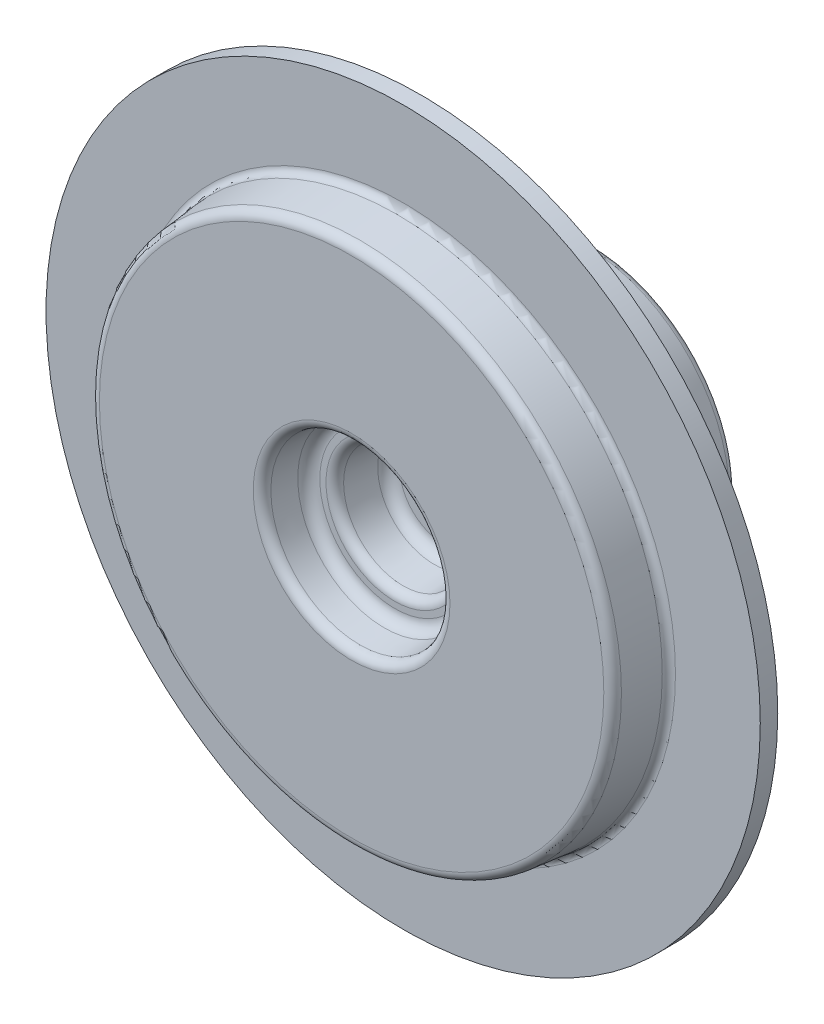
ISO-10303-21;
HEADER;
FILE_DESCRIPTION(('STEP AP214'),'2;1');
FILE_NAME('part.step','',(''),(''),'','','');
FILE_SCHEMA(('AUTOMOTIVE_DESIGN { 1 0 10303 214 1 1 1 1 }'));
ENDSEC;
DATA;
#1=APPLICATION_CONTEXT('core data for automotive mechanical design processes');
#2=APPLICATION_PROTOCOL_DEFINITION('international standard','automotive_design',2000,#1);
#3=PRODUCT_CONTEXT('',#1,'mechanical');
#4=PRODUCT('Part','Part','',(#3));
#5=PRODUCT_RELATED_PRODUCT_CATEGORY('part','',(#4));
#6=PRODUCT_DEFINITION_FORMATION('','',#4);
#7=PRODUCT_DEFINITION_CONTEXT('part definition',#1,'design');
#8=PRODUCT_DEFINITION('design','',#6,#7);
#9=PRODUCT_DEFINITION_SHAPE('','',#8);
#10=(LENGTH_UNIT() NAMED_UNIT(*) SI_UNIT(.MILLI.,.METRE.));
#11=(NAMED_UNIT(*) PLANE_ANGLE_UNIT() SI_UNIT($,.RADIAN.));
#12=(NAMED_UNIT(*) SI_UNIT($,.STERADIAN.) SOLID_ANGLE_UNIT());
#13=UNCERTAINTY_MEASURE_WITH_UNIT(LENGTH_MEASURE(1.E-05),#10,'distance_accuracy_value','');
#14=(GEOMETRIC_REPRESENTATION_CONTEXT(3) GLOBAL_UNCERTAINTY_ASSIGNED_CONTEXT((#13)) GLOBAL_UNIT_ASSIGNED_CONTEXT((#10,
#11,#12)) REPRESENTATION_CONTEXT('',''));
#15=CARTESIAN_POINT('',(0.,0.,0.));
#16=DIRECTION('',(0.,0.,1.));
#17=DIRECTION('',(1.,0.,0.));
#18=AXIS2_PLACEMENT_3D('',#15,#16,#17);
#19=CARTESIAN_POINT('',(-1.69097512300319E-13,0.,-49.2959876543209));
#20=DIRECTION('',(0.,0.,-1.));
#21=DIRECTION('',(-1.,0.,0.));
#22=AXIS2_PLACEMENT_3D('',#19,#20,#21);
#23=CONICAL_SURFACE('',#22,26.1000000000002,0.104719755119659);
#24=CARTESIAN_POINT('',(-1.04593999800566E-13,0.,-30.4916639679921));
#25=DIRECTION('',(0.,0.,-1.));
#26=DIRECTION('',(-1.,0.,0.));
#27=AXIS2_PLACEMENT_3D('',#24,#25,#26);
#28=CIRCLE('',#27,24.1235859392604);
#29=CARTESIAN_POINT('',(-24.1235859392605,0.,-30.491663967992));
#30=VERTEX_POINT('',#29);
#31=EDGE_CURVE('E69',#30,#30,#28,.F.);
#32=ORIENTED_EDGE('',*,*,#31,.T.);
#33=EDGE_LOOP('',(#32));
#34=FACE_BOUND('',#33,.T.);
#35=CARTESIAN_POINT('',(-1.56810750930692E-13,0.,-45.7141015073914));
#36=DIRECTION('',(0.,0.,1.));
#37=DIRECTION('',(1.,0.,0.));
#38=AXIS2_PLACEMENT_3D('',#35,#36,#37);
#39=CIRCLE('',#38,25.7235285957184);
#40=CARTESIAN_POINT('',(25.7235285957183,0.,-45.7141015073915));
#41=VERTEX_POINT('',#40);
#42=EDGE_CURVE('E153',#41,#41,#39,.F.);
#43=ORIENTED_EDGE('',*,*,#42,.T.);
#44=EDGE_LOOP('',(#43));
#45=FACE_BOUND('',#44,.T.);
#46=ADVANCED_FACE('F41',(#34,#45),#23,.F.);
#47=CARTESIAN_POINT('',(26.1,0.,-49.2959876543208));
#48=DIRECTION('',(0.,0.,-1.));
#49=DIRECTION('',(-1.,0.,0.));
#50=AXIS2_PLACEMENT_3D('',#47,#48,#49);
#51=PLANE('',#50);
#52=CARTESIAN_POINT('',(-1.69097512300318E-13,0.,-49.2959876543207));
#53=DIRECTION('',(0.,0.,-1.));
#54=DIRECTION('',(-1.,0.,0.));
#55=AXIS2_PLACEMENT_3D('',#52,#53,#54);
#56=CIRCLE('',#55,32.1535514260961);
#57=CARTESIAN_POINT('',(-32.1535514260963,0.,-49.2959876543206));
#58=VERTEX_POINT('',#57);
#59=EDGE_CURVE('E73',#58,#58,#56,.T.);
#60=ORIENTED_EDGE('',*,*,#59,.T.);
#61=EDGE_LOOP('',(#60));
#62=FACE_BOUND('',#61,.T.);
#63=CARTESIAN_POINT('',(-1.69097512300319E-13,0.,-49.2959876543207));
#64=DIRECTION('',(0.,0.,-1.));
#65=DIRECTION('',(-1.,0.,0.));
#66=AXIS2_PLACEMENT_3D('',#63,#64,#65);
#67=CIRCLE('',#66,29.7016161771915);
#68=CARTESIAN_POINT('',(-29.7016161771917,0.,-49.2959876543206));
#69=VERTEX_POINT('',#68);
#70=EDGE_CURVE('E157',#69,#69,#67,.F.);
#71=ORIENTED_EDGE('',*,*,#70,.T.);
#72=EDGE_LOOP('',(#71));
#73=FACE_BOUND('',#72,.T.);
#74=ADVANCED_FACE('F212',(#62,#73),#51,.T.);
#75=CARTESIAN_POINT('',(-2.32557118779704E-13,0.,-67.7959876543206));
#76=DIRECTION('',(0.,0.,-1.));
#77=DIRECTION('',(-1.,0.,0.));
#78=AXIS2_PLACEMENT_3D('',#75,#76,#77);
#79=CONICAL_SURFACE('',#78,38.6000000000003,0.104719755119664);
#80=CARTESIAN_POINT('',(-1.84455964012352E-13,0.,-53.7733453379825));
#81=DIRECTION('',(0.,0.,-1.));
#82=DIRECTION('',(-1.,0.,0.));
#83=AXIS2_PLACEMENT_3D('',#80,#81,#82);
#84=CIRCLE('',#83,37.1261609029374);
#85=CARTESIAN_POINT('',(-37.1261609029376,0.,-53.7733453379823));
#86=VERTEX_POINT('',#85);
#87=EDGE_CURVE('E77',#86,#86,#84,.F.);
#88=ORIENTED_EDGE('',*,*,#87,.T.);
#89=EDGE_LOOP('',(#88));
#90=FACE_BOUND('',#89,.T.);
#91=CARTESIAN_POINT('',(-2.20270357410077E-13,0.,-64.2141015073913));
#92=DIRECTION('',(0.,0.,1.));
#93=DIRECTION('',(1.,0.,0.));
#94=AXIS2_PLACEMENT_3D('',#91,#92,#93);
#95=CIRCLE('',#94,38.2235285957186);
#96=CARTESIAN_POINT('',(38.2235285957184,0.,-64.2141015073914));
#97=VERTEX_POINT('',#96);
#98=EDGE_CURVE('E121',#97,#97,#95,.F.);
#99=ORIENTED_EDGE('',*,*,#98,.T.);
#100=EDGE_LOOP('',(#99));
#101=FACE_BOUND('',#100,.T.);
#102=ADVANCED_FACE('F218',(#90,#101),#79,.F.);
#103=CARTESIAN_POINT('',(38.6000000000001,0.,-67.7959876543208));
#104=DIRECTION('',(0.,0.,-1.));
#105=DIRECTION('',(-1.,0.,0.));
#106=AXIS2_PLACEMENT_3D('',#103,#104,#105);
#107=PLANE('',#106);
#108=CARTESIAN_POINT('',(-2.32557118779705E-13,0.,-67.7959876543207));
#109=DIRECTION('',(0.,0.,-1.));
#110=DIRECTION('',(-1.,0.,0.));
#111=AXIS2_PLACEMENT_3D('',#108,#109,#110);
#112=CIRCLE('',#111,42.2016161771917);
#113=CARTESIAN_POINT('',(-42.2016161771919,0.,-67.7959876543205));
#114=VERTEX_POINT('',#113);
#115=EDGE_CURVE('E125',#114,#114,#112,.F.);
#116=ORIENTED_EDGE('',*,*,#115,.T.);
#117=EDGE_LOOP('',(#116));
#118=FACE_BOUND('',#117,.T.);
#119=CARTESIAN_POINT('',(-2.32557118779705E-13,0.,-67.7959876543207));
#120=DIRECTION('',(0.,0.,-1.));
#121=DIRECTION('',(-1.,0.,0.));
#122=AXIS2_PLACEMENT_3D('',#119,#120,#121);
#123=CIRCLE('',#122,58.2436014752911);
#124=CARTESIAN_POINT('',(-58.2436014752913,0.,-67.7959876543205));
#125=VERTEX_POINT('',#124);
#126=EDGE_CURVE('E169',#125,#125,#123,.T.);
#127=ORIENTED_EDGE('',*,*,#126,.T.);
#128=EDGE_LOOP('',(#127));
#129=FACE_BOUND('',#128,.T.);
#130=ADVANCED_FACE('F585',(#118,#129),#107,.T.);
#131=CARTESIAN_POINT('',(-1.47143918707449E-13,0.,-42.8959876543207));
#132=DIRECTION('',(0.,0.,1.));
#133=DIRECTION('',(1.,0.,0.));
#134=AXIS2_PLACEMENT_3D('',#131,#132,#133);
#135=CONICAL_SURFACE('',#134,65.990541819641,0.174532925199432);
#136=CARTESIAN_POINT('',(-1.61316881263876E-13,0.,-47.027746765986));
#137=DIRECTION('',(0.,0.,1.));
#138=DIRECTION('',(1.,0.,0.));
#139=AXIS2_PLACEMENT_3D('',#136,#137,#138);
#140=CIRCLE('',#139,65.2620012104663);
#141=CARTESIAN_POINT('',(65.2620012104662,0.,-47.0277467659862));
#142=VERTEX_POINT('',#141);
#143=EDGE_CURVE('E81',#142,#142,#140,.F.);
#144=ORIENTED_EDGE('',*,*,#143,.T.);
#145=EDGE_LOOP('',(#144));
#146=FACE_BOUND('',#145,.T.);
#147=CARTESIAN_POINT('',(-2.21218748734563E-13,0.,-64.4905803649884));
#148=DIRECTION('',(0.,0.,-1.));
#149=DIRECTION('',(-1.,0.,0.));
#150=AXIS2_PLACEMENT_3D('',#147,#148,#149);
#151=CIRCLE('',#150,62.1828324873399);
#152=CARTESIAN_POINT('',(-62.1828324873402,0.,-64.4905803649882));
#153=VERTEX_POINT('',#152);
#154=EDGE_CURVE('E173',#153,#153,#151,.F.);
#155=ORIENTED_EDGE('',*,*,#154,.T.);
#156=EDGE_LOOP('',(#155));
#157=FACE_BOUND('',#156,.T.);
#158=ADVANCED_FACE('F575',(#146,#157),#135,.T.);
#159=CARTESIAN_POINT('',(65.9905418196408,0.,-42.8959876543209));
#160=DIRECTION('',(0.,0.,-1.));
#161=DIRECTION('',(-1.,0.,0.));
#162=AXIS2_PLACEMENT_3D('',#159,#160,#161);
#163=PLANE('',#162);
#164=CARTESIAN_POINT('',(-1.47143918707449E-13,0.,-42.8959876543206));
#165=DIRECTION('',(0.,0.,-1.));
#166=DIRECTION('',(-1.,0.,0.));
#167=AXIS2_PLACEMENT_3D('',#164,#165,#166);
#168=CIRCLE('',#167,70.1860399755274);
#169=CARTESIAN_POINT('',(-70.1860399755275,0.,-42.8959876543204));
#170=VERTEX_POINT('',#169);
#171=EDGE_CURVE('E85',#170,#170,#168,.F.);
#172=ORIENTED_EDGE('',*,*,#171,.T.);
#173=EDGE_LOOP('',(#172));
#174=FACE_BOUND('',#173,.T.);
#175=CARTESIAN_POINT('',(-1.47143918707449E-13,0.,-42.8959876543206));
#176=DIRECTION('',(0.,0.,-1.));
#177=DIRECTION('',(-1.,0.,0.));
#178=AXIS2_PLACEMENT_3D('',#175,#176,#177);
#179=CIRCLE('',#178,72.9983838228087);
#180=CARTESIAN_POINT('',(-72.9983838228089,0.,-42.8959876543204));
#181=VERTEX_POINT('',#180);
#182=EDGE_CURVE('E129',#181,#181,#179,.T.);
#183=ORIENTED_EDGE('',*,*,#182,.T.);
#184=EDGE_LOOP('',(#183));
#185=FACE_BOUND('',#184,.T.);
#186=ADVANCED_FACE('F565',(#174,#185),#163,.T.);
#187=CARTESIAN_POINT('',(0.,0.,-17.3959876543206));
#188=DIRECTION('',(0.,0.,1.));
#189=DIRECTION('',(1.,0.,0.));
#190=AXIS2_PLACEMENT_3D('',#187,#188,#189);
#191=CONICAL_SURFACE('',#190,79.2801579992745,0.104719755119645);
#192=CARTESIAN_POINT('',(0.,0.,-21.8733453379823));
#193=DIRECTION('',(0.,0.,1.));
#194=DIRECTION('',(1.,0.,0.));
#195=AXIS2_PLACEMENT_3D('',#192,#193,#194);
#196=CIRCLE('',#195,78.8095687439224);
#197=CARTESIAN_POINT('',(78.8095687439224,0.,-21.8733453379826));
#198=VERTEX_POINT('',#197);
#199=EDGE_CURVE('E89',#198,#198,#196,.F.);
#200=ORIENTED_EDGE('',*,*,#199,.T.);
#201=EDGE_LOOP('',(#200));
#202=FACE_BOUND('',#201,.T.);
#203=CARTESIAN_POINT('',(-1.34857157337822E-13,0.,-39.3141015073912));
#204=DIRECTION('',(0.,0.,-1.));
#205=DIRECTION('',(-1.,0.,0.));
#206=AXIS2_PLACEMENT_3D('',#203,#204,#205);
#207=CIRCLE('',#206,76.9764714042818);
#208=CARTESIAN_POINT('',(-76.976471404282,0.,-39.314101507391));
#209=VERTEX_POINT('',#208);
#210=EDGE_CURVE('E133',#209,#209,#207,.F.);
#211=ORIENTED_EDGE('',*,*,#210,.T.);
#212=EDGE_LOOP('',(#211));
#213=FACE_BOUND('',#212,.T.);
#214=ADVANCED_FACE('F555',(#202,#213),#191,.T.);
#215=CARTESIAN_POINT('',(79.2801579992745,0.,-17.3959876543208));
#216=DIRECTION('',(0.,0.,-1.));
#217=DIRECTION('',(-1.,0.,0.));
#218=AXIS2_PLACEMENT_3D('',#215,#216,#217);
#219=PLANE('',#218);
#220=CARTESIAN_POINT('',(0.,0.,-17.3959876543205));
#221=DIRECTION('',(0.,0.,-1.));
#222=DIRECTION('',(-1.,0.,0.));
#223=AXIS2_PLACEMENT_3D('',#220,#221,#222);
#224=CIRCLE('',#223,83.7821782207638);
#225=CARTESIAN_POINT('',(-83.7821782207638,0.,-17.3959876543202));
#226=VERTEX_POINT('',#225);
#227=EDGE_CURVE('E93',#226,#226,#224,.F.);
#228=ORIENTED_EDGE('',*,*,#227,.T.);
#229=EDGE_LOOP('',(#228));
#230=FACE_BOUND('',#229,.T.);
#231=CARTESIAN_POINT('',(0.,0.,-17.3959876543205));
#232=DIRECTION('',(0.,0.,-1.));
#233=DIRECTION('',(-1.,0.,0.));
#234=AXIS2_PLACEMENT_3D('',#231,#232,#233);
#235=CIRCLE('',#234,107.617071540778);
#236=CARTESIAN_POINT('',(-107.617071540778,0.,-17.3959876543202));
#237=VERTEX_POINT('',#236);
#238=EDGE_CURVE('E137',#237,#237,#235,.T.);
#239=ORIENTED_EDGE('',*,*,#238,.T.);
#240=EDGE_LOOP('',(#239));
#241=FACE_BOUND('',#240,.T.);
#242=ADVANCED_FACE('F400',(#230,#241),#219,.T.);
#243=CARTESIAN_POINT('',(0.,0.,10.2504208021552));
#244=DIRECTION('',(0.,0.,1.));
#245=DIRECTION('',(1.,0.,0.));
#246=AXIS2_PLACEMENT_3D('',#243,#244,#245);
#247=CONICAL_SURFACE('',#246,114.12444233663,0.104719755119649);
#248=CARTESIAN_POINT('',(0.,0.,7.56400619195805));
#249=DIRECTION('',(0.,0.,1.));
#250=DIRECTION('',(1.,0.,0.));
#251=AXIS2_PLACEMENT_3D('',#248,#249,#250);
#252=CIRCLE('',#251,113.842088783419);
#253=CARTESIAN_POINT('',(113.842088783419,0.,7.56400619195766));
#254=VERTEX_POINT('',#253);
#255=EDGE_CURVE('E10',#254,#254,#252,.F.);
#256=ORIENTED_EDGE('',*,*,#255,.T.);
#257=EDGE_LOOP('',(#256));
#258=FACE_BOUND('',#257,.T.);
#259=CARTESIAN_POINT('',(0.,0.,-13.8141015073914));
#260=DIRECTION('',(0.,0.,-1.));
#261=DIRECTION('',(-1.,0.,0.));
#262=AXIS2_PLACEMENT_3D('',#259,#260,#261);
#263=CIRCLE('',#262,111.595159122252);
#264=CARTESIAN_POINT('',(-111.595159122252,0.,-13.814101507391));
#265=VERTEX_POINT('',#264);
#266=EDGE_CURVE('E141',#265,#265,#263,.F.);
#267=ORIENTED_EDGE('',*,*,#266,.T.);
#268=EDGE_LOOP('',(#267));
#269=FACE_BOUND('',#268,.T.);
#270=ADVANCED_FACE('F394',(#258,#269),#247,.T.);
#271=CARTESIAN_POINT('',(114.12444233663,0.,10.2504208021547));
#272=DIRECTION('',(0.,0.,-1.));
#273=DIRECTION('',(-1.,0.,0.));
#274=AXIS2_PLACEMENT_3D('',#271,#272,#273);
#275=PLANE('',#274);
#276=CARTESIAN_POINT('',(0.,0.,10.2504208021551));
#277=DIRECTION('',(0.,0.,-1.));
#278=DIRECTION('',(-1.,0.,0.));
#279=AXIS2_PLACEMENT_3D('',#276,#277,#278);
#280=CIRCLE('',#279,116.825654469523);
#281=CARTESIAN_POINT('',(-116.825654469523,0.,10.2504208021555));
#282=VERTEX_POINT('',#281);
#283=EDGE_CURVE('E49',#282,#282,#280,.F.);
#284=ORIENTED_EDGE('',*,*,#283,.T.);
#285=EDGE_LOOP('',(#284));
#286=FACE_BOUND('',#285,.T.);
#287=CARTESIAN_POINT('',(0.,0.,10.2504208021552));
#288=DIRECTION('',(0.,0.,1.));
#289=DIRECTION('',(1.,0.,0.));
#290=AXIS2_PLACEMENT_3D('',#287,#288,#289);
#291=CIRCLE('',#290,127.79444233663);
#292=CARTESIAN_POINT('',(127.79444233663,0.,10.2504208021548));
#293=VERTEX_POINT('',#292);
#294=EDGE_CURVE('E177',#293,#293,#291,.T.);
#295=ORIENTED_EDGE('',*,*,#294,.F.);
#296=EDGE_LOOP('',(#295));
#297=FACE_BOUND('',#296,.T.);
#298=ADVANCED_FACE('F399',(#286,#297),#275,.T.);
#299=CARTESIAN_POINT('',(0.,0.,5.79449500213691));
#300=DIRECTION('',(0.,0.,-1.));
#301=DIRECTION('',(-1.,0.,0.));
#302=AXIS2_PLACEMENT_3D('',#299,#300,#301);
#303=CONICAL_SURFACE('',#302,144.310706439968,1.30728006977126);
#304=ORIENTED_EDGE('',*,*,#294,.T.);
#305=EDGE_LOOP('',(#304));
#306=FACE_BOUND('',#305,.T.);
#307=CARTESIAN_POINT('',(0.,0.,5.79449500213691));
#308=DIRECTION('',(0.,0.,1.));
#309=DIRECTION('',(1.,0.,0.));
#310=AXIS2_PLACEMENT_3D('',#307,#308,#309);
#311=CIRCLE('',#310,144.310706439968);
#312=CARTESIAN_POINT('',(144.310706439968,0.,5.79449500213642));
#313=VERTEX_POINT('',#312);
#314=EDGE_CURVE('E181',#313,#313,#311,.T.);
#315=ORIENTED_EDGE('',*,*,#314,.F.);
#316=EDGE_LOOP('',(#315));
#317=FACE_BOUND('',#316,.T.);
#318=ADVANCED_FACE('F208',(#306,#317),#303,.F.);
#319=CARTESIAN_POINT('',(144.310706439968,0.,5.79449500213638));
#320=DIRECTION('',(0.,0.,-1.));
#321=DIRECTION('',(-1.,0.,0.));
#322=AXIS2_PLACEMENT_3D('',#319,#320,#321);
#323=PLANE('',#322);
#324=ORIENTED_EDGE('',*,*,#314,.T.);
#325=EDGE_LOOP('',(#324));
#326=FACE_BOUND('',#325,.T.);
#327=CARTESIAN_POINT('',(0.,0.,5.79449500213691));
#328=DIRECTION('',(0.,0.,1.));
#329=DIRECTION('',(1.,0.,0.));
#330=AXIS2_PLACEMENT_3D('',#327,#328,#329);
#331=CIRCLE('',#330,153.205859623628);
#332=CARTESIAN_POINT('',(153.205859623628,0.,5.79449500213639));
#333=VERTEX_POINT('',#332);
#334=EDGE_CURVE('E185',#333,#333,#331,.T.);
#335=ORIENTED_EDGE('',*,*,#334,.F.);
#336=EDGE_LOOP('',(#335));
#337=FACE_BOUND('',#336,.T.);
#338=ADVANCED_FACE('F198',(#326,#337),#323,.T.);
#339=CARTESIAN_POINT('',(4.29898307583795E-12,0.,1253.2568560575));
#340=DIRECTION('',(0.,0.,1.));
#341=DIRECTION('',(1.,0.,0.));
#342=AXIS2_PLACEMENT_3D('',#339,#340,#341);
#343=CYLINDRICAL_SURFACE('',#342,153.205859623628);
#344=ORIENTED_EDGE('',*,*,#334,.T.);
#345=EDGE_LOOP('',(#344));
#346=FACE_BOUND('',#345,.T.);
#347=CARTESIAN_POINT('',(0.,0.,13.2884208021551));
#348=DIRECTION('',(0.,0.,1.));
#349=DIRECTION('',(1.,0.,0.));
#350=AXIS2_PLACEMENT_3D('',#347,#348,#349);
#351=CIRCLE('',#350,153.205859623628);
#352=CARTESIAN_POINT('',(153.205859623628,0.,13.2884208021546));
#353=VERTEX_POINT('',#352);
#354=EDGE_CURVE('E189',#353,#353,#351,.T.);
#355=ORIENTED_EDGE('',*,*,#354,.F.);
#356=EDGE_LOOP('',(#355));
#357=FACE_BOUND('',#356,.T.);
#358=ADVANCED_FACE('F196',(#346,#357),#343,.T.);
#359=CARTESIAN_POINT('',(153.205859623628,0.,13.2884208021546));
#360=DIRECTION('',(0.,0.,1.));
#361=DIRECTION('',(1.,0.,0.));
#362=AXIS2_PLACEMENT_3D('',#359,#360,#361);
#363=PLANE('',#362);
#364=CARTESIAN_POINT('',(0.,0.,13.2884208021552));
#365=DIRECTION('',(0.,0.,1.));
#366=DIRECTION('',(1.,0.,0.));
#367=AXIS2_PLACEMENT_3D('',#364,#365,#366);
#368=CIRCLE('',#367,116.825654469524);
#369=CARTESIAN_POINT('',(116.825654469524,0.,13.2884208021548));
#370=VERTEX_POINT('',#369);
#371=EDGE_CURVE('E54',#370,#370,#368,.F.);
#372=ORIENTED_EDGE('',*,*,#371,.T.);
#373=EDGE_LOOP('',(#372));
#374=FACE_BOUND('',#373,.T.);
#375=ORIENTED_EDGE('',*,*,#354,.T.);
#376=EDGE_LOOP('',(#375));
#377=FACE_BOUND('',#376,.T.);
#378=ADVANCED_FACE('F194',(#374,#377),#363,.T.);
#379=CARTESIAN_POINT('',(1.21444577905307E-13,0.,35.4040123456796));
#380=DIRECTION('',(0.,0.,-1.));
#381=DIRECTION('',(-1.,0.,0.));
#382=AXIS2_PLACEMENT_3D('',#379,#380,#381);
#383=CONICAL_SURFACE('',#382,111.8,0.104719755119656);
#384=CARTESIAN_POINT('',(0.,0.,15.9748354123522));
#385=DIRECTION('',(0.,0.,-1.));
#386=DIRECTION('',(-1.,0.,0.));
#387=AXIS2_PLACEMENT_3D('',#384,#385,#386);
#388=CIRCLE('',#387,113.842088783419);
#389=CARTESIAN_POINT('',(-113.842088783419,0.,15.9748354123526));
#390=VERTEX_POINT('',#389);
#391=EDGE_CURVE('E59',#390,#390,#388,.F.);
#392=ORIENTED_EDGE('',*,*,#391,.T.);
#393=EDGE_LOOP('',(#392));
#394=FACE_BOUND('',#393,.T.);
#395=CARTESIAN_POINT('',(1.09157816535679E-13,0.,31.8221261987501));
#396=DIRECTION('',(0.,0.,1.));
#397=DIRECTION('',(1.,0.,0.));
#398=AXIS2_PLACEMENT_3D('',#395,#396,#397);
#399=CIRCLE('',#398,112.176471404282);
#400=CARTESIAN_POINT('',(112.176471404282,0.,31.8221261987498));
#401=VERTEX_POINT('',#400);
#402=EDGE_CURVE('E145',#401,#401,#399,.F.);
#403=ORIENTED_EDGE('',*,*,#402,.T.);
#404=EDGE_LOOP('',(#403));
#405=FACE_BOUND('',#404,.T.);
#406=ADVANCED_FACE('F205',(#394,#405),#383,.T.);
#407=CARTESIAN_POINT('',(111.8,0.,35.404012345679));
#408=DIRECTION('',(0.,0.,1.));
#409=DIRECTION('',(1.,0.,0.));
#410=AXIS2_PLACEMENT_3D('',#407,#408,#409);
#411=PLANE('',#410);
#412=CARTESIAN_POINT('',(1.21444577905307E-13,0.,35.4040123456794));
#413=DIRECTION('',(0.,0.,1.));
#414=DIRECTION('',(1.,0.,0.));
#415=AXIS2_PLACEMENT_3D('',#412,#413,#414);
#416=CIRCLE('',#415,42.2016161771913);
#417=CARTESIAN_POINT('',(42.2016161771914,0.,35.4040123456792));
#418=VERTEX_POINT('',#417);
#419=EDGE_CURVE('E113',#418,#418,#416,.F.);
#420=ORIENTED_EDGE('',*,*,#419,.T.);
#421=EDGE_LOOP('',(#420));
#422=FACE_BOUND('',#421,.T.);
#423=CARTESIAN_POINT('',(1.21444577905306E-13,0.,35.4040123456794));
#424=DIRECTION('',(0.,0.,1.));
#425=DIRECTION('',(1.,0.,0.));
#426=AXIS2_PLACEMENT_3D('',#423,#424,#425);
#427=CIRCLE('',#426,108.198383822808);
#428=CARTESIAN_POINT('',(108.198383822809,0.,35.404012345679));
#429=VERTEX_POINT('',#428);
#430=EDGE_CURVE('E149',#429,#429,#427,.T.);
#431=ORIENTED_EDGE('',*,*,#430,.T.);
#432=EDGE_LOOP('',(#431));
#433=FACE_BOUND('',#432,.T.);
#434=ADVANCED_FACE('F293',(#422,#433),#411,.T.);
#435=CARTESIAN_POINT('',(0.,0.,16.9040123456794));
#436=DIRECTION('',(0.,0.,1.));
#437=DIRECTION('',(1.,0.,0.));
#438=AXIS2_PLACEMENT_3D('',#435,#436,#437);
#439=CONICAL_SURFACE('',#438,36.6555716475851,0.104719755119649);
#440=CARTESIAN_POINT('',(0.,0.,21.381370029341));
#441=DIRECTION('',(0.,0.,1.));
#442=DIRECTION('',(1.,0.,0.));
#443=AXIS2_PLACEMENT_3D('',#440,#441,#442);
#444=CIRCLE('',#443,37.1261609029372);
#445=CARTESIAN_POINT('',(37.1261609029372,0.,21.3813700293409));
#446=VERTEX_POINT('',#445);
#447=EDGE_CURVE('E105',#446,#446,#444,.F.);
#448=ORIENTED_EDGE('',*,*,#447,.T.);
#449=EDGE_LOOP('',(#448));
#450=FACE_BOUND('',#449,.T.);
#451=CARTESIAN_POINT('',(1.09157816535679E-13,0.,31.82212619875));
#452=DIRECTION('',(0.,0.,-1.));
#453=DIRECTION('',(-1.,0.,0.));
#454=AXIS2_PLACEMENT_3D('',#451,#452,#453);
#455=CIRCLE('',#454,38.2235285957182);
#456=CARTESIAN_POINT('',(-38.2235285957181,0.,31.8221261987501));
#457=VERTEX_POINT('',#456);
#458=EDGE_CURVE('E117',#457,#457,#455,.F.);
#459=ORIENTED_EDGE('',*,*,#458,.T.);
#460=EDGE_LOOP('',(#459));
#461=FACE_BOUND('',#460,.T.);
#462=ADVANCED_FACE('F300',(#450,#461),#439,.F.);
#463=CARTESIAN_POINT('',(36.6555716475851,0.,16.9040123456791));
#464=DIRECTION('',(0.,0.,1.));
#465=DIRECTION('',(1.,0.,0.));
#466=AXIS2_PLACEMENT_3D('',#463,#464,#465);
#467=PLANE('',#466);
#468=CARTESIAN_POINT('',(0.,0.,16.9040123456792));
#469=DIRECTION('',(0.,0.,1.));
#470=DIRECTION('',(1.,0.,0.));
#471=AXIS2_PLACEMENT_3D('',#468,#469,#470);
#472=CIRCLE('',#471,32.1535514260958);
#473=CARTESIAN_POINT('',(32.1535514260958,0.,16.9040123456791));
#474=VERTEX_POINT('',#473);
#475=EDGE_CURVE('E109',#474,#474,#472,.T.);
#476=ORIENTED_EDGE('',*,*,#475,.T.);
#477=EDGE_LOOP('',(#476));
#478=FACE_BOUND('',#477,.T.);
#479=CARTESIAN_POINT('',(0.,0.,16.9040123456792));
#480=DIRECTION('',(0.,0.,1.));
#481=DIRECTION('',(1.,0.,0.));
#482=AXIS2_PLACEMENT_3D('',#479,#480,#481);
#483=CIRCLE('',#482,29.4914077066599);
#484=CARTESIAN_POINT('',(29.4914077066599,0.,16.9040123456791));
#485=VERTEX_POINT('',#484);
#486=EDGE_CURVE('E161',#485,#485,#483,.F.);
#487=ORIENTED_EDGE('',*,*,#486,.T.);
#488=EDGE_LOOP('',(#487));
#489=FACE_BOUND('',#488,.T.);
#490=ADVANCED_FACE('F306',(#478,#489),#467,.T.);
#491=CARTESIAN_POINT('',(0.,0.,-4.37766902431158));
#492=DIRECTION('',(0.,0.,1.));
#493=DIRECTION('',(1.,0.,0.));
#494=AXIS2_PLACEMENT_3D('',#491,#492,#493);
#495=CONICAL_SURFACE('',#494,23.6529966839081,0.104719755119644);
#496=CARTESIAN_POINT('',(0.,0.,0.0996886593503752));
#497=DIRECTION('',(0.,0.,1.));
#498=DIRECTION('',(1.,0.,0.));
#499=AXIS2_PLACEMENT_3D('',#496,#497,#498);
#500=CIRCLE('',#499,24.1235859392602);
#501=CARTESIAN_POINT('',(24.1235859392602,0.,0.0996886593502924));
#502=VERTEX_POINT('',#501);
#503=EDGE_CURVE('E97',#502,#502,#500,.F.);
#504=ORIENTED_EDGE('',*,*,#503,.T.);
#505=EDGE_LOOP('',(#504));
#506=FACE_BOUND('',#505,.T.);
#507=CARTESIAN_POINT('',(0.,0.,13.3221261987498));
#508=DIRECTION('',(0.,0.,-1.));
#509=DIRECTION('',(-1.,0.,0.));
#510=AXIS2_PLACEMENT_3D('',#507,#508,#509);
#511=CIRCLE('',#510,25.5133201251868);
#512=CARTESIAN_POINT('',(-25.5133201251867,0.,13.3221261987499));
#513=VERTEX_POINT('',#512);
#514=EDGE_CURVE('E165',#513,#513,#511,.F.);
#515=ORIENTED_EDGE('',*,*,#514,.T.);
#516=EDGE_LOOP('',(#515));
#517=FACE_BOUND('',#516,.T.);
#518=ADVANCED_FACE('F312',(#506,#517),#495,.F.);
#519=CARTESIAN_POINT('',(0.,0.,-4.37766902431143));
#520=DIRECTION('',(0.,0.,1.));
#521=DIRECTION('',(1.,0.,0.));
#522=AXIS2_PLACEMENT_3D('',#519,#520,#521);
#523=PLANE('',#522);
#524=CARTESIAN_POINT('',(0.,0.,-4.37766902431144));
#525=DIRECTION('',(0.,0.,1.));
#526=DIRECTION('',(1.,0.,0.));
#527=AXIS2_PLACEMENT_3D('',#524,#525,#526);
#528=CIRCLE('',#527,19.1509764624189);
#529=CARTESIAN_POINT('',(19.1509764624188,0.,-4.3776690243115));
#530=VERTEX_POINT('',#529);
#531=EDGE_CURVE('E101',#530,#530,#528,.T.);
#532=ORIENTED_EDGE('',*,*,#531,.T.);
#533=EDGE_LOOP('',(#532));
#534=FACE_BOUND('',#533,.T.);
#535=ADVANCED_FACE('F316',(#534),#523,.T.);
#536=CARTESIAN_POINT('',(23.6529966839081,0.,-26.0143062843304));
#537=DIRECTION('',(0.,0.,-1.));
#538=DIRECTION('',(-1.,0.,0.));
#539=AXIS2_PLACEMENT_3D('',#536,#537,#538);
#540=PLANE('',#539);
#541=CARTESIAN_POINT('',(0.,0.,-26.0143062843303));
#542=DIRECTION('',(0.,0.,-1.));
#543=DIRECTION('',(-1.,0.,0.));
#544=AXIS2_PLACEMENT_3D('',#541,#542,#543);
#545=CIRCLE('',#544,19.150976462419);
#546=CARTESIAN_POINT('',(-19.1509764624191,0.,-26.0143062843302));
#547=VERTEX_POINT('',#546);
#548=EDGE_CURVE('E65',#547,#547,#545,.T.);
#549=ORIENTED_EDGE('',*,*,#548,.T.);
#550=EDGE_LOOP('',(#549));
#551=FACE_BOUND('',#550,.T.);
#552=ADVANCED_FACE('F228',(#551),#540,.T.);
#553=CARTESIAN_POINT('',(-2.18836122784162E-13,0.,-63.7959876543207));
#554=DIRECTION('',(0.,0.,-1.));
#555=DIRECTION('',(-1.,0.,0.));
#556=AXIS2_PLACEMENT_3D('',#553,#554,#555);
#557=TOROIDAL_SURFACE('',#556,58.2436014752911,4.);
#558=ORIENTED_EDGE('',*,*,#126,.F.);
#559=EDGE_LOOP('',(#558));
#560=FACE_BOUND('',#559,.T.);
#561=ORIENTED_EDGE('',*,*,#154,.F.);
#562=EDGE_LOOP('',(#561));
#563=FACE_BOUND('',#562,.T.);
#564=ADVANCED_FACE('F224',(#560,#563),#557,.T.);
#565=CARTESIAN_POINT('',(0.,0.,12.9040123456792));
#566=DIRECTION('',(0.,0.,1.));
#567=DIRECTION('',(1.,0.,0.));
#568=AXIS2_PLACEMENT_3D('',#565,#566,#567);
#569=TOROIDAL_SURFACE('',#568,29.4914077066599,4.);
#570=ORIENTED_EDGE('',*,*,#486,.F.);
#571=EDGE_LOOP('',(#570));
#572=FACE_BOUND('',#571,.T.);
#573=ORIENTED_EDGE('',*,*,#514,.F.);
#574=EDGE_LOOP('',(#573));
#575=FACE_BOUND('',#574,.T.);
#576=ADVANCED_FACE('F227',(#572,#575),#569,.T.);
#577=CARTESIAN_POINT('',(-1.55376516304776E-13,0.,-45.2959876543208));
#578=DIRECTION('',(0.,0.,-1.));
#579=DIRECTION('',(-1.,0.,0.));
#580=AXIS2_PLACEMENT_3D('',#577,#578,#579);
#581=TOROIDAL_SURFACE('',#580,29.7016161771915,4.);
#582=ORIENTED_EDGE('',*,*,#42,.F.);
#583=EDGE_LOOP('',(#582));
#584=FACE_BOUND('',#583,.T.);
#585=ORIENTED_EDGE('',*,*,#70,.F.);
#586=EDGE_LOOP('',(#585));
#587=FACE_BOUND('',#586,.T.);
#588=ADVANCED_FACE('F232',(#584,#587),#581,.T.);
#589=CARTESIAN_POINT('',(1.07723581909763E-13,0.,31.4040123456794));
#590=DIRECTION('',(0.,0.,1.));
#591=DIRECTION('',(1.,0.,0.));
#592=AXIS2_PLACEMENT_3D('',#589,#590,#591);
#593=TOROIDAL_SURFACE('',#592,108.198383822808,4.);
#594=ORIENTED_EDGE('',*,*,#402,.F.);
#595=EDGE_LOOP('',(#594));
#596=FACE_BOUND('',#595,.T.);
#597=ORIENTED_EDGE('',*,*,#430,.F.);
#598=EDGE_LOOP('',(#597));
#599=FACE_BOUND('',#598,.T.);
#600=ADVANCED_FACE('F236',(#596,#599),#593,.T.);
#601=CARTESIAN_POINT('',(0.,0.,-13.3959876543205));
#602=DIRECTION('',(0.,0.,-1.));
#603=DIRECTION('',(-1.,0.,0.));
#604=AXIS2_PLACEMENT_3D('',#601,#602,#603);
#605=TOROIDAL_SURFACE('',#604,107.617071540778,4.);
#606=ORIENTED_EDGE('',*,*,#238,.F.);
#607=EDGE_LOOP('',(#606));
#608=FACE_BOUND('',#607,.T.);
#609=ORIENTED_EDGE('',*,*,#266,.F.);
#610=EDGE_LOOP('',(#609));
#611=FACE_BOUND('',#610,.T.);
#612=ADVANCED_FACE('F240',(#608,#611),#605,.T.);
#613=CARTESIAN_POINT('',(-1.33422922711906E-13,0.,-38.8959876543206));
#614=DIRECTION('',(0.,0.,-1.));
#615=DIRECTION('',(-1.,0.,0.));
#616=AXIS2_PLACEMENT_3D('',#613,#614,#615);
#617=TOROIDAL_SURFACE('',#616,72.9983838228087,4.);
#618=ORIENTED_EDGE('',*,*,#182,.F.);
#619=EDGE_LOOP('',(#618));
#620=FACE_BOUND('',#619,.T.);
#621=ORIENTED_EDGE('',*,*,#210,.F.);
#622=EDGE_LOOP('',(#621));
#623=FACE_BOUND('',#622,.T.);
#624=ADVANCED_FACE('F244',(#620,#623),#617,.T.);
#625=CARTESIAN_POINT('',(-2.18836122784162E-13,0.,-63.7959876543207));
#626=DIRECTION('',(0.,0.,-1.));
#627=DIRECTION('',(-1.,0.,0.));
#628=AXIS2_PLACEMENT_3D('',#625,#626,#627);
#629=TOROIDAL_SURFACE('',#628,42.2016161771917,4.);
#630=ORIENTED_EDGE('',*,*,#98,.F.);
#631=EDGE_LOOP('',(#630));
#632=FACE_BOUND('',#631,.T.);
#633=ORIENTED_EDGE('',*,*,#115,.F.);
#634=EDGE_LOOP('',(#633));
#635=FACE_BOUND('',#634,.T.);
#636=ADVANCED_FACE('F248',(#632,#635),#629,.T.);
#637=CARTESIAN_POINT('',(1.07723581909763E-13,0.,31.4040123456794));
#638=DIRECTION('',(0.,0.,1.));
#639=DIRECTION('',(1.,0.,0.));
#640=AXIS2_PLACEMENT_3D('',#637,#638,#639);
#641=TOROIDAL_SURFACE('',#640,42.2016161771913,4.);
#642=ORIENTED_EDGE('',*,*,#419,.F.);
#643=EDGE_LOOP('',(#642));
#644=FACE_BOUND('',#643,.T.);
#645=ORIENTED_EDGE('',*,*,#458,.F.);
#646=EDGE_LOOP('',(#645));
#647=FACE_BOUND('',#646,.T.);
#648=ADVANCED_FACE('F252',(#644,#647),#641,.T.);
#649=CARTESIAN_POINT('',(0.,0.,21.9040123456792));
#650=DIRECTION('',(0.,0.,1.));
#651=DIRECTION('',(1.,0.,0.));
#652=AXIS2_PLACEMENT_3D('',#649,#650,#651);
#653=TOROIDAL_SURFACE('',#652,32.1535514260958,5.);
#654=ORIENTED_EDGE('',*,*,#447,.F.);
#655=EDGE_LOOP('',(#654));
#656=FACE_BOUND('',#655,.T.);
#657=ORIENTED_EDGE('',*,*,#475,.F.);
#658=EDGE_LOOP('',(#657));
#659=FACE_BOUND('',#658,.T.);
#660=ADVANCED_FACE('F256',(#656,#659),#653,.F.);
#661=CARTESIAN_POINT('',(0.,0.,0.622330975688566));
#662=DIRECTION('',(0.,0.,1.));
#663=DIRECTION('',(1.,0.,0.));
#664=AXIS2_PLACEMENT_3D('',#661,#662,#663);
#665=TOROIDAL_SURFACE('',#664,19.1509764624189,5.);
#666=ORIENTED_EDGE('',*,*,#503,.F.);
#667=EDGE_LOOP('',(#666));
#668=FACE_BOUND('',#667,.T.);
#669=ORIENTED_EDGE('',*,*,#531,.F.);
#670=EDGE_LOOP('',(#669));
#671=FACE_BOUND('',#670,.T.);
#672=ADVANCED_FACE('F260',(#668,#671),#665,.F.);
#673=CARTESIAN_POINT('',(0.,0.,-22.3959876543205));
#674=DIRECTION('',(0.,0.,-1.));
#675=DIRECTION('',(-1.,0.,0.));
#676=AXIS2_PLACEMENT_3D('',#673,#674,#675);
#677=TOROIDAL_SURFACE('',#676,83.7821782207638,5.);
#678=ORIENTED_EDGE('',*,*,#199,.F.);
#679=EDGE_LOOP('',(#678));
#680=FACE_BOUND('',#679,.T.);
#681=ORIENTED_EDGE('',*,*,#227,.F.);
#682=EDGE_LOOP('',(#681));
#683=FACE_BOUND('',#682,.T.);
#684=ADVANCED_FACE('F264',(#680,#683),#677,.F.);
#685=CARTESIAN_POINT('',(-1.64295163701878E-13,0.,-47.8959876543206));
#686=DIRECTION('',(0.,0.,-1.));
#687=DIRECTION('',(-1.,0.,0.));
#688=AXIS2_PLACEMENT_3D('',#685,#686,#687);
#689=TOROIDAL_SURFACE('',#688,70.1860399755274,5.);
#690=ORIENTED_EDGE('',*,*,#143,.F.);
#691=EDGE_LOOP('',(#690));
#692=FACE_BOUND('',#691,.T.);
#693=ORIENTED_EDGE('',*,*,#171,.F.);
#694=EDGE_LOOP('',(#693));
#695=FACE_BOUND('',#694,.T.);
#696=ADVANCED_FACE('F268',(#692,#695),#689,.F.);
#697=CARTESIAN_POINT('',(-1.86248757294747E-13,0.,-54.2959876543207));
#698=DIRECTION('',(0.,0.,-1.));
#699=DIRECTION('',(-1.,0.,0.));
#700=AXIS2_PLACEMENT_3D('',#697,#698,#699);
#701=TOROIDAL_SURFACE('',#700,32.1535514260961,5.);
#702=ORIENTED_EDGE('',*,*,#59,.F.);
#703=EDGE_LOOP('',(#702));
#704=FACE_BOUND('',#703,.T.);
#705=ORIENTED_EDGE('',*,*,#87,.F.);
#706=EDGE_LOOP('',(#705));
#707=FACE_BOUND('',#706,.T.);
#708=ADVANCED_FACE('F272',(#704,#707),#701,.F.);
#709=CARTESIAN_POINT('',(-1.06386793082961E-13,0.,-31.0143062843303));
#710=DIRECTION('',(0.,0.,-1.));
#711=DIRECTION('',(-1.,0.,0.));
#712=AXIS2_PLACEMENT_3D('',#709,#710,#711);
#713=TOROIDAL_SURFACE('',#712,19.150976462419,5.);
#714=ORIENTED_EDGE('',*,*,#548,.F.);
#715=EDGE_LOOP('',(#714));
#716=FACE_BOUND('',#715,.T.);
#717=ORIENTED_EDGE('',*,*,#31,.F.);
#718=EDGE_LOOP('',(#717));
#719=FACE_BOUND('',#718,.T.);
#720=ADVANCED_FACE('F276',(#716,#719),#713,.F.);
#721=CARTESIAN_POINT('',(0.,0.,16.2884208021552));
#722=DIRECTION('',(0.,0.,1.));
#723=DIRECTION('',(1.,0.,0.));
#724=AXIS2_PLACEMENT_3D('',#721,#722,#723);
#725=TOROIDAL_SURFACE('',#724,116.825654469524,3.);
#726=ORIENTED_EDGE('',*,*,#371,.F.);
#727=EDGE_LOOP('',(#726));
#728=FACE_BOUND('',#727,.T.);
#729=ORIENTED_EDGE('',*,*,#391,.F.);
#730=EDGE_LOOP('',(#729));
#731=FACE_BOUND('',#730,.T.);
#732=ADVANCED_FACE('F279',(#728,#731),#725,.F.);
#733=CARTESIAN_POINT('',(0.,0.,7.25042080215512));
#734=DIRECTION('',(0.,0.,-1.));
#735=DIRECTION('',(-1.,0.,0.));
#736=AXIS2_PLACEMENT_3D('',#733,#734,#735);
#737=TOROIDAL_SURFACE('',#736,116.825654469523,3.);
#738=ORIENTED_EDGE('',*,*,#255,.F.);
#739=EDGE_LOOP('',(#738));
#740=FACE_BOUND('',#739,.T.);
#741=ORIENTED_EDGE('',*,*,#283,.F.);
#742=EDGE_LOOP('',(#741));
#743=FACE_BOUND('',#742,.T.);
#744=ADVANCED_FACE('F43',(#740,#743),#737,.F.);
#745=CLOSED_SHELL('',(#46,#74,#102,#130,#158,#186,#214,#242,#270,#298,#318,#338,#358,#378,#406,
#434,#462,#490,#518,#535,#552,#564,#576,#588,#600,#612,#624,#636,#648,#660,#672,#684,#696,#708,
#720,#732,#744));
#746=MANIFOLD_SOLID_BREP('B2',#745);
#747=ADVANCED_BREP_SHAPE_REPRESENTATION('',(#18,#746),#14);
#748=SHAPE_DEFINITION_REPRESENTATION(#9,#747);
ENDSEC;
END-ISO-10303-21;
